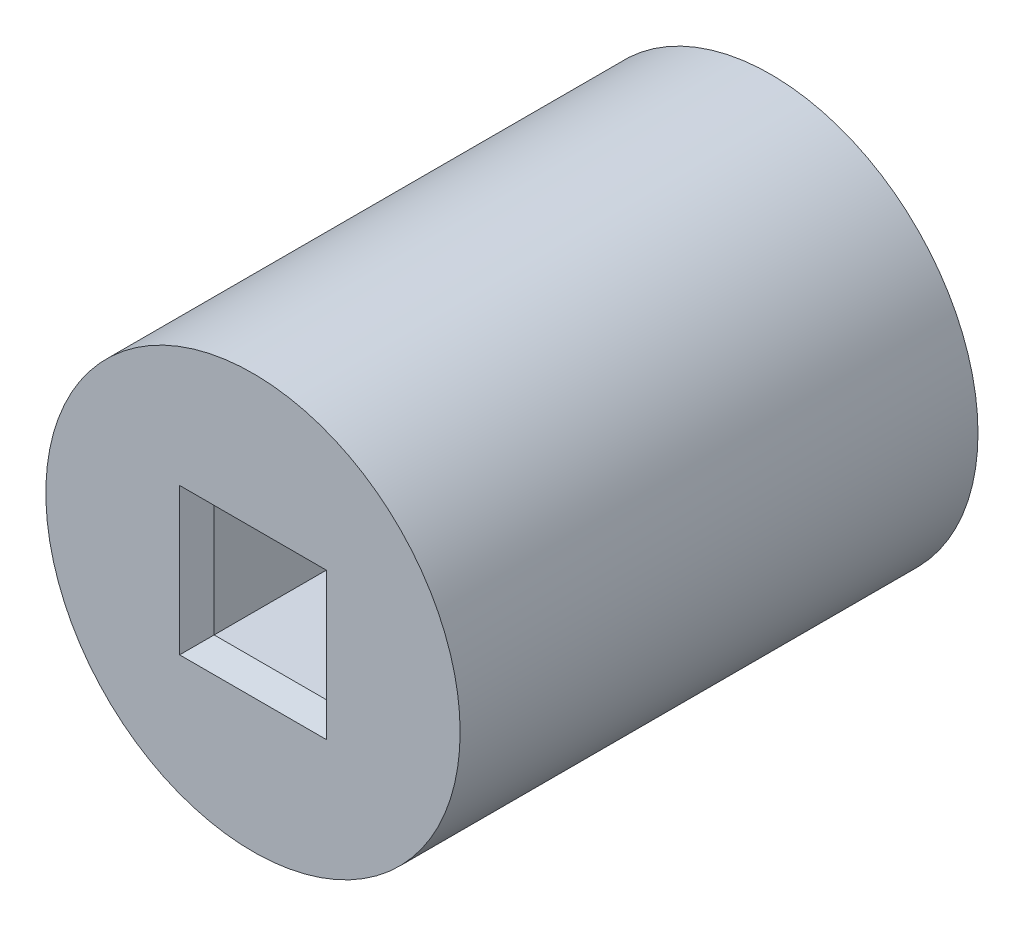
ISO-10303-21;
HEADER;
FILE_DESCRIPTION(('STEP AP214'),'2;1');
FILE_NAME('part.step','',(''),(''),'','','');
FILE_SCHEMA(('AUTOMOTIVE_DESIGN { 1 0 10303 214 1 1 1 1 }'));
ENDSEC;
DATA;
#1=APPLICATION_CONTEXT('core data for automotive mechanical design processes');
#2=APPLICATION_PROTOCOL_DEFINITION('international standard','automotive_design',2000,#1);
#3=PRODUCT_CONTEXT('',#1,'mechanical');
#4=PRODUCT('Part','Part','',(#3));
#5=PRODUCT_RELATED_PRODUCT_CATEGORY('part','',(#4));
#6=PRODUCT_DEFINITION_FORMATION('','',#4);
#7=PRODUCT_DEFINITION_CONTEXT('part definition',#1,'design');
#8=PRODUCT_DEFINITION('design','',#6,#7);
#9=PRODUCT_DEFINITION_SHAPE('','',#8);
#10=(LENGTH_UNIT() NAMED_UNIT(*) SI_UNIT(.MILLI.,.METRE.));
#11=(NAMED_UNIT(*) PLANE_ANGLE_UNIT() SI_UNIT($,.RADIAN.));
#12=(NAMED_UNIT(*) SI_UNIT($,.STERADIAN.) SOLID_ANGLE_UNIT());
#13=UNCERTAINTY_MEASURE_WITH_UNIT(LENGTH_MEASURE(1.E-05),#10,'distance_accuracy_value','');
#14=(GEOMETRIC_REPRESENTATION_CONTEXT(3) GLOBAL_UNCERTAINTY_ASSIGNED_CONTEXT((#13)) GLOBAL_UNIT_ASSIGNED_CONTEXT((#10,
#11,#12)) REPRESENTATION_CONTEXT('',''));
#15=CARTESIAN_POINT('',(0.,0.,0.));
#16=DIRECTION('',(0.,0.,1.));
#17=DIRECTION('',(1.,0.,0.));
#18=AXIS2_PLACEMENT_3D('',#15,#16,#17);
#19=CARTESIAN_POINT('',(0.,0.,15.));
#20=DIRECTION('',(0.,0.,-1.));
#21=DIRECTION('',(-1.,0.,0.));
#22=AXIS2_PLACEMENT_3D('',#19,#20,#21);
#23=CYLINDRICAL_SURFACE('',#22,6.);
#24=CARTESIAN_POINT('',(0.,0.,15.));
#25=DIRECTION('',(0.,0.,1.));
#26=DIRECTION('',(1.,0.,0.));
#27=AXIS2_PLACEMENT_3D('',#24,#25,#26);
#28=CIRCLE('',#27,6.);
#29=CARTESIAN_POINT('',(6.,0.,15.));
#30=VERTEX_POINT('',#29);
#31=EDGE_CURVE('E129',#30,#30,#28,.T.);
#32=ORIENTED_EDGE('',*,*,#31,.F.);
#33=EDGE_LOOP('',(#32));
#34=FACE_BOUND('',#33,.T.);
#35=CARTESIAN_POINT('',(0.,0.,0.));
#36=DIRECTION('',(0.,0.,1.));
#37=DIRECTION('',(1.,0.,0.));
#38=AXIS2_PLACEMENT_3D('',#35,#36,#37);
#39=CIRCLE('',#38,6.);
#40=CARTESIAN_POINT('',(6.,0.,0.));
#41=VERTEX_POINT('',#40);
#42=EDGE_CURVE('E128',#41,#41,#39,.T.);
#43=ORIENTED_EDGE('',*,*,#42,.T.);
#44=EDGE_LOOP('',(#43));
#45=FACE_BOUND('',#44,.T.);
#46=ADVANCED_FACE('F35',(#34,#45),#23,.T.);
#47=CARTESIAN_POINT('',(0.,0.,15.));
#48=DIRECTION('',(0.,0.,1.));
#49=DIRECTION('',(1.,0.,0.));
#50=AXIS2_PLACEMENT_3D('',#47,#48,#49);
#51=PLANE('',#50);
#52=DIRECTION('',(1.,0.,0.));
#53=VECTOR('',#52,1.);
#54=CARTESIAN_POINT('',(1.625,2.12499999999999,15.));
#55=LINE('',#54,#53);
#56=CARTESIAN_POINT('',(-2.12499999999999,2.12499999999999,15.));
#57=VERTEX_POINT('',#56);
#58=CARTESIAN_POINT('',(2.12499999999999,2.12499999999999,15.));
#59=VERTEX_POINT('',#58);
#60=EDGE_CURVE('E139',#57,#59,#55,.T.);
#61=ORIENTED_EDGE('',*,*,#60,.T.);
#62=DIRECTION('',(0.,-1.,0.));
#63=VECTOR('',#62,1.);
#64=CARTESIAN_POINT('',(2.12499999999999,-1.625,15.));
#65=LINE('',#64,#63);
#66=CARTESIAN_POINT('',(2.12499999999999,-2.12499999999999,15.));
#67=VERTEX_POINT('',#66);
#68=EDGE_CURVE('E141',#59,#67,#65,.T.);
#69=ORIENTED_EDGE('',*,*,#68,.T.);
#70=DIRECTION('',(-1.,0.,0.));
#71=VECTOR('',#70,1.);
#72=CARTESIAN_POINT('',(-1.625,-2.12499999999999,15.));
#73=LINE('',#72,#71);
#74=CARTESIAN_POINT('',(-2.12499999999999,-2.12499999999999,15.));
#75=VERTEX_POINT('',#74);
#76=EDGE_CURVE('E135',#67,#75,#73,.T.);
#77=ORIENTED_EDGE('',*,*,#76,.T.);
#78=DIRECTION('',(0.,1.,0.));
#79=VECTOR('',#78,1.);
#80=CARTESIAN_POINT('',(-2.12499999999999,1.625,15.));
#81=LINE('',#80,#79);
#82=EDGE_CURVE('E137',#75,#57,#81,.T.);
#83=ORIENTED_EDGE('',*,*,#82,.T.);
#84=EDGE_LOOP('',(#61,#69,#77,#83));
#85=FACE_BOUND('',#84,.T.);
#86=ORIENTED_EDGE('',*,*,#31,.T.);
#87=EDGE_LOOP('',(#86));
#88=FACE_BOUND('',#87,.T.);
#89=ADVANCED_FACE('F180',(#85,#88),#51,.T.);
#90=CARTESIAN_POINT('',(0.,0.,0.));
#91=DIRECTION('',(0.,0.,1.));
#92=DIRECTION('',(1.,0.,0.));
#93=AXIS2_PLACEMENT_3D('',#90,#91,#92);
#94=PLANE('',#93);
#95=CARTESIAN_POINT('',(0.,0.,0.));
#96=DIRECTION('',(0.,0.,1.));
#97=DIRECTION('',(1.,0.,0.));
#98=AXIS2_PLACEMENT_3D('',#95,#96,#97);
#99=CIRCLE('',#98,3.1);
#100=CARTESIAN_POINT('',(3.1,0.,0.));
#101=VERTEX_POINT('',#100);
#102=EDGE_CURVE('E11',#101,#101,#99,.T.);
#103=ORIENTED_EDGE('',*,*,#102,.T.);
#104=EDGE_LOOP('',(#103));
#105=FACE_BOUND('',#104,.T.);
#106=ORIENTED_EDGE('',*,*,#42,.F.);
#107=EDGE_LOOP('',(#106));
#108=FACE_BOUND('',#107,.T.);
#109=ADVANCED_FACE('F186',(#105,#108),#94,.F.);
#110=CARTESIAN_POINT('',(0.,0.,10.));
#111=DIRECTION('',(0.,0.,-1.));
#112=DIRECTION('',(-1.,0.,0.));
#113=AXIS2_PLACEMENT_3D('',#110,#111,#112);
#114=CYLINDRICAL_SURFACE('',#113,2.6);
#115=CARTESIAN_POINT('',(0.,0.,0.499999999999994));
#116=DIRECTION('',(0.,0.,1.));
#117=DIRECTION('',(1.,0.,0.));
#118=AXIS2_PLACEMENT_3D('',#115,#116,#117);
#119=CIRCLE('',#118,2.6);
#120=CARTESIAN_POINT('',(2.6,0.,0.499999999999994));
#121=VERTEX_POINT('',#120);
#122=EDGE_CURVE('E44',#121,#121,#119,.F.);
#123=ORIENTED_EDGE('',*,*,#122,.T.);
#124=EDGE_LOOP('',(#123));
#125=FACE_BOUND('',#124,.T.);
#126=CARTESIAN_POINT('',(0.,0.,10.));
#127=DIRECTION('',(0.,0.,-1.));
#128=DIRECTION('',(-1.,0.,0.));
#129=AXIS2_PLACEMENT_3D('',#126,#127,#128);
#130=CIRCLE('',#129,2.6);
#131=CARTESIAN_POINT('',(-2.6,0.,10.));
#132=VERTEX_POINT('',#131);
#133=EDGE_CURVE('E122',#132,#132,#130,.T.);
#134=ORIENTED_EDGE('',*,*,#133,.F.);
#135=EDGE_LOOP('',(#134));
#136=FACE_BOUND('',#135,.T.);
#137=ADVANCED_FACE('F262',(#125,#136),#114,.F.);
#138=CARTESIAN_POINT('',(0.,0.,10.));
#139=DIRECTION('',(0.,0.,-1.));
#140=DIRECTION('',(-1.,0.,0.));
#141=AXIS2_PLACEMENT_3D('',#138,#139,#140);
#142=PLANE('',#141);
#143=DIRECTION('',(0.,1.,0.));
#144=VECTOR('',#143,1.);
#145=CARTESIAN_POINT('',(1.625,1.625,10.));
#146=LINE('',#145,#144);
#147=CARTESIAN_POINT('',(1.625,-1.625,10.));
#148=VERTEX_POINT('',#147);
#149=CARTESIAN_POINT('',(1.625,1.625,10.));
#150=VERTEX_POINT('',#149);
#151=EDGE_CURVE('E97',#148,#150,#146,.T.);
#152=ORIENTED_EDGE('',*,*,#151,.T.);
#153=DIRECTION('',(-1.,0.,0.));
#154=VECTOR('',#153,1.);
#155=CARTESIAN_POINT('',(-1.625,1.625,10.));
#156=LINE('',#155,#154);
#157=CARTESIAN_POINT('',(-1.625,1.625,10.));
#158=VERTEX_POINT('',#157);
#159=EDGE_CURVE('E105',#150,#158,#156,.T.);
#160=ORIENTED_EDGE('',*,*,#159,.T.);
#161=DIRECTION('',(0.,-1.,0.));
#162=VECTOR('',#161,1.);
#163=CARTESIAN_POINT('',(-1.625,1.625,10.));
#164=LINE('',#163,#162);
#165=CARTESIAN_POINT('',(-1.625,-1.625,10.));
#166=VERTEX_POINT('',#165);
#167=EDGE_CURVE('E109',#158,#166,#164,.T.);
#168=ORIENTED_EDGE('',*,*,#167,.T.);
#169=DIRECTION('',(1.,0.,0.));
#170=VECTOR('',#169,1.);
#171=CARTESIAN_POINT('',(-1.625,-1.625,10.));
#172=LINE('',#171,#170);
#173=EDGE_CURVE('E102',#166,#148,#172,.T.);
#174=ORIENTED_EDGE('',*,*,#173,.T.);
#175=EDGE_LOOP('',(#152,#160,#168,#174));
#176=FACE_BOUND('',#175,.T.);
#177=ORIENTED_EDGE('',*,*,#133,.T.);
#178=EDGE_LOOP('',(#177));
#179=FACE_BOUND('',#178,.T.);
#180=ADVANCED_FACE('F111',(#176,#179),#142,.T.);
#181=CARTESIAN_POINT('',(1.625,1.625,10.));
#182=DIRECTION('',(1.,0.,0.));
#183=DIRECTION('',(0.,1.,0.));
#184=AXIS2_PLACEMENT_3D('',#181,#182,#183);
#185=PLANE('',#184);
#186=DIRECTION('',(0.,0.,1.));
#187=VECTOR('',#186,1.);
#188=CARTESIAN_POINT('',(1.625,-1.625,10.));
#189=LINE('',#188,#187);
#190=CARTESIAN_POINT('',(1.625,-1.625,14.5));
#191=VERTEX_POINT('',#190);
#192=EDGE_CURVE('E120',#148,#191,#189,.T.);
#193=ORIENTED_EDGE('',*,*,#192,.T.);
#194=DIRECTION('',(0.,1.,0.));
#195=VECTOR('',#194,1.);
#196=CARTESIAN_POINT('',(1.625,1.625,14.5));
#197=LINE('',#196,#195);
#198=CARTESIAN_POINT('',(1.625,1.625,14.5));
#199=VERTEX_POINT('',#198);
#200=EDGE_CURVE('E100',#191,#199,#197,.T.);
#201=ORIENTED_EDGE('',*,*,#200,.T.);
#202=DIRECTION('',(0.,0.,1.));
#203=VECTOR('',#202,1.);
#204=CARTESIAN_POINT('',(1.625,1.625,10.));
#205=LINE('',#204,#203);
#206=EDGE_CURVE('E92',#150,#199,#205,.T.);
#207=ORIENTED_EDGE('',*,*,#206,.F.);
#208=ORIENTED_EDGE('',*,*,#151,.F.);
#209=EDGE_LOOP('',(#193,#201,#207,#208));
#210=FACE_BOUND('',#209,.T.);
#211=ADVANCED_FACE('F95',(#210),#185,.F.);
#212=CARTESIAN_POINT('',(-1.625,-1.625,10.));
#213=DIRECTION('',(0.,-1.,0.));
#214=DIRECTION('',(0.,0.,-1.));
#215=AXIS2_PLACEMENT_3D('',#212,#213,#214);
#216=PLANE('',#215);
#217=DIRECTION('',(0.,0.,1.));
#218=VECTOR('',#217,1.);
#219=CARTESIAN_POINT('',(-1.625,-1.625,10.));
#220=LINE('',#219,#218);
#221=CARTESIAN_POINT('',(-1.625,-1.625,14.5));
#222=VERTEX_POINT('',#221);
#223=EDGE_CURVE('E123',#166,#222,#220,.T.);
#224=ORIENTED_EDGE('',*,*,#223,.T.);
#225=DIRECTION('',(1.,0.,0.));
#226=VECTOR('',#225,1.);
#227=CARTESIAN_POINT('',(1.625,-1.625,14.5));
#228=LINE('',#227,#226);
#229=EDGE_CURVE('E146',#222,#191,#228,.T.);
#230=ORIENTED_EDGE('',*,*,#229,.T.);
#231=ORIENTED_EDGE('',*,*,#192,.F.);
#232=ORIENTED_EDGE('',*,*,#173,.F.);
#233=EDGE_LOOP('',(#224,#230,#231,#232));
#234=FACE_BOUND('',#233,.T.);
#235=ADVANCED_FACE('F169',(#234),#216,.F.);
#236=CARTESIAN_POINT('',(-1.625,1.625,10.));
#237=DIRECTION('',(-1.,0.,0.));
#238=DIRECTION('',(0.,-1.,0.));
#239=AXIS2_PLACEMENT_3D('',#236,#237,#238);
#240=PLANE('',#239);
#241=DIRECTION('',(0.,0.,1.));
#242=VECTOR('',#241,1.);
#243=CARTESIAN_POINT('',(-1.625,1.625,10.));
#244=LINE('',#243,#242);
#245=CARTESIAN_POINT('',(-1.625,1.625,14.5));
#246=VERTEX_POINT('',#245);
#247=EDGE_CURVE('E101',#158,#246,#244,.T.);
#248=ORIENTED_EDGE('',*,*,#247,.T.);
#249=DIRECTION('',(0.,-1.,0.));
#250=VECTOR('',#249,1.);
#251=CARTESIAN_POINT('',(-1.625,-1.625,14.5));
#252=LINE('',#251,#250);
#253=EDGE_CURVE('E52',#246,#222,#252,.T.);
#254=ORIENTED_EDGE('',*,*,#253,.T.);
#255=ORIENTED_EDGE('',*,*,#223,.F.);
#256=ORIENTED_EDGE('',*,*,#167,.F.);
#257=EDGE_LOOP('',(#248,#254,#255,#256));
#258=FACE_BOUND('',#257,.T.);
#259=ADVANCED_FACE('F170',(#258),#240,.F.);
#260=CARTESIAN_POINT('',(-1.625,1.625,10.));
#261=DIRECTION('',(0.,1.,0.));
#262=DIRECTION('',(0.,0.,1.));
#263=AXIS2_PLACEMENT_3D('',#260,#261,#262);
#264=PLANE('',#263);
#265=ORIENTED_EDGE('',*,*,#206,.T.);
#266=DIRECTION('',(-1.,0.,0.));
#267=VECTOR('',#266,1.);
#268=CARTESIAN_POINT('',(-1.625,1.625,14.5));
#269=LINE('',#268,#267);
#270=EDGE_CURVE('E60',#199,#246,#269,.T.);
#271=ORIENTED_EDGE('',*,*,#270,.T.);
#272=ORIENTED_EDGE('',*,*,#247,.F.);
#273=ORIENTED_EDGE('',*,*,#159,.F.);
#274=EDGE_LOOP('',(#265,#271,#272,#273));
#275=FACE_BOUND('',#274,.T.);
#276=ADVANCED_FACE('F106',(#275),#264,.F.);
#277=CARTESIAN_POINT('',(-1.625,1.625,14.5));
#278=DIRECTION('',(0.707106781186545,0.,0.70710678118655));
#279=DIRECTION('',(0.,1.,0.));
#280=AXIS2_PLACEMENT_3D('',#277,#278,#279);
#281=PLANE('',#280);
#282=DIRECTION('',(-0.577350269189628,0.577350269189627,0.577350269189623));
#283=VECTOR('',#282,1.);
#284=CARTESIAN_POINT('',(-1.625,1.625,14.5));
#285=LINE('',#284,#283);
#286=EDGE_CURVE('E116',#57,#246,#285,.F.);
#287=ORIENTED_EDGE('',*,*,#286,.F.);
#288=ORIENTED_EDGE('',*,*,#82,.F.);
#289=DIRECTION('',(-0.577350269189628,-0.577350269189627,0.577350269189623));
#290=VECTOR('',#289,1.);
#291=CARTESIAN_POINT('',(-0.541666666666661,-0.541666666666662,13.4166666666667));
#292=LINE('',#291,#290);
#293=EDGE_CURVE('E39',#222,#75,#292,.T.);
#294=ORIENTED_EDGE('',*,*,#293,.F.);
#295=ORIENTED_EDGE('',*,*,#253,.F.);
#296=EDGE_LOOP('',(#287,#288,#294,#295));
#297=FACE_BOUND('',#296,.T.);
#298=ADVANCED_FACE('F161',(#297),#281,.T.);
#299=CARTESIAN_POINT('',(-1.625,-1.625,14.5));
#300=DIRECTION('',(0.,0.707106781186545,0.70710678118655));
#301=DIRECTION('',(-1.,0.,0.));
#302=AXIS2_PLACEMENT_3D('',#299,#300,#301);
#303=PLANE('',#302);
#304=ORIENTED_EDGE('',*,*,#293,.T.);
#305=ORIENTED_EDGE('',*,*,#76,.F.);
#306=DIRECTION('',(-0.577350269189627,0.577350269189627,-0.577350269189623));
#307=VECTOR('',#306,1.);
#308=CARTESIAN_POINT('',(0.541666666666661,-0.541666666666661,13.4166666666667));
#309=LINE('',#308,#307);
#310=EDGE_CURVE('E152',#191,#67,#309,.F.);
#311=ORIENTED_EDGE('',*,*,#310,.F.);
#312=ORIENTED_EDGE('',*,*,#229,.F.);
#313=EDGE_LOOP('',(#304,#305,#311,#312));
#314=FACE_BOUND('',#313,.T.);
#315=ADVANCED_FACE('F167',(#314),#303,.T.);
#316=CARTESIAN_POINT('',(-1.625,1.625,14.5));
#317=DIRECTION('',(0.,-0.707106781186545,0.70710678118655));
#318=DIRECTION('',(1.,0.,0.));
#319=AXIS2_PLACEMENT_3D('',#316,#317,#318);
#320=PLANE('',#319);
#321=ORIENTED_EDGE('',*,*,#286,.T.);
#322=ORIENTED_EDGE('',*,*,#270,.F.);
#323=DIRECTION('',(0.577350269189627,0.577350269189627,0.577350269189623));
#324=VECTOR('',#323,1.);
#325=CARTESIAN_POINT('',(1.625,1.625,14.5));
#326=LINE('',#325,#324);
#327=EDGE_CURVE('E150',#59,#199,#326,.F.);
#328=ORIENTED_EDGE('',*,*,#327,.F.);
#329=ORIENTED_EDGE('',*,*,#60,.F.);
#330=EDGE_LOOP('',(#321,#322,#328,#329));
#331=FACE_BOUND('',#330,.T.);
#332=ADVANCED_FACE('F157',(#331),#320,.T.);
#333=CARTESIAN_POINT('',(1.625,1.625,14.5));
#334=DIRECTION('',(-0.707106781186545,0.,0.70710678118655));
#335=DIRECTION('',(0.,-1.,0.));
#336=AXIS2_PLACEMENT_3D('',#333,#334,#335);
#337=PLANE('',#336);
#338=ORIENTED_EDGE('',*,*,#310,.T.);
#339=ORIENTED_EDGE('',*,*,#68,.F.);
#340=ORIENTED_EDGE('',*,*,#327,.T.);
#341=ORIENTED_EDGE('',*,*,#200,.F.);
#342=EDGE_LOOP('',(#338,#339,#340,#341));
#343=FACE_BOUND('',#342,.T.);
#344=ADVANCED_FACE('F193',(#343),#337,.T.);
#345=CARTESIAN_POINT('',(0.,0.,0.499999999999994));
#346=DIRECTION('',(0.,0.,-1.));
#347=DIRECTION('',(-1.,0.,0.));
#348=AXIS2_PLACEMENT_3D('',#345,#346,#347);
#349=CONICAL_SURFACE('',#348,2.6,0.78539816339745);
#350=ORIENTED_EDGE('',*,*,#102,.F.);
#351=EDGE_LOOP('',(#350));
#352=FACE_BOUND('',#351,.T.);
#353=ORIENTED_EDGE('',*,*,#122,.F.);
#354=EDGE_LOOP('',(#353));
#355=FACE_BOUND('',#354,.T.);
#356=ADVANCED_FACE('F37',(#352,#355),#349,.F.);
#357=CLOSED_SHELL('',(#46,#89,#109,#137,#180,#211,#235,#259,#276,#298,#315,#332,#344,#356));
#358=MANIFOLD_SOLID_BREP('B2',#357);
#359=ADVANCED_BREP_SHAPE_REPRESENTATION('',(#18,#358),#14);
#360=SHAPE_DEFINITION_REPRESENTATION(#9,#359);
ENDSEC;
END-ISO-10303-21;
